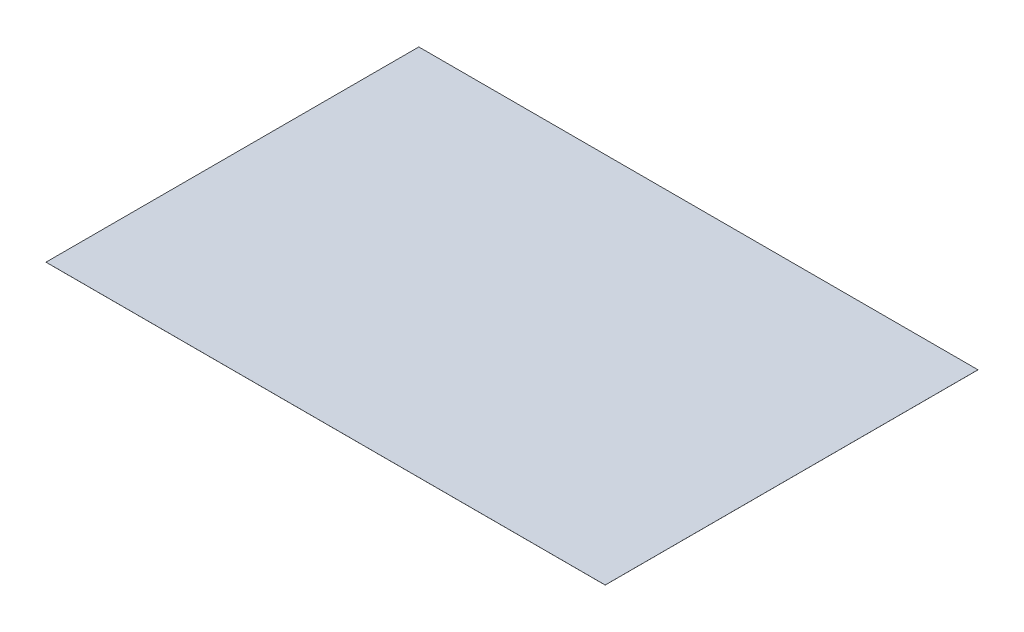
ISO-10303-21;
HEADER;
FILE_DESCRIPTION(('STEP AP214'),'2;1');
FILE_NAME('part.step','',(''),(''),'','','');
FILE_SCHEMA(('AUTOMOTIVE_DESIGN { 1 0 10303 214 1 1 1 1 }'));
ENDSEC;
DATA;
#1=APPLICATION_CONTEXT('core data for automotive mechanical design processes');
#2=APPLICATION_PROTOCOL_DEFINITION('international standard','automotive_design',2000,#1);
#3=PRODUCT_CONTEXT('',#1,'mechanical');
#4=PRODUCT('Part','Part','',(#3));
#5=PRODUCT_RELATED_PRODUCT_CATEGORY('part','',(#4));
#6=PRODUCT_DEFINITION_FORMATION('','',#4);
#7=PRODUCT_DEFINITION_CONTEXT('part definition',#1,'design');
#8=PRODUCT_DEFINITION('design','',#6,#7);
#9=PRODUCT_DEFINITION_SHAPE('','',#8);
#10=(LENGTH_UNIT() NAMED_UNIT(*) SI_UNIT(.MILLI.,.METRE.));
#11=(NAMED_UNIT(*) PLANE_ANGLE_UNIT() SI_UNIT($,.RADIAN.));
#12=(NAMED_UNIT(*) SI_UNIT($,.STERADIAN.) SOLID_ANGLE_UNIT());
#13=UNCERTAINTY_MEASURE_WITH_UNIT(LENGTH_MEASURE(1.E-05),#10,'distance_accuracy_value','');
#14=(GEOMETRIC_REPRESENTATION_CONTEXT(3) GLOBAL_UNCERTAINTY_ASSIGNED_CONTEXT((#13)) GLOBAL_UNIT_ASSIGNED_CONTEXT((#10,
#11,#12)) REPRESENTATION_CONTEXT('',''));
#15=CARTESIAN_POINT('',(0.,0.,0.));
#16=DIRECTION('',(0.,0.,1.));
#17=DIRECTION('',(1.,0.,0.));
#18=AXIS2_PLACEMENT_3D('',#15,#16,#17);
#19=CARTESIAN_POINT('',(300.,0.05,-200.));
#20=DIRECTION('',(-1.,0.,0.));
#21=DIRECTION('',(0.,0.,1.));
#22=AXIS2_PLACEMENT_3D('',#19,#20,#21);
#23=PLANE('',#22);
#24=DIRECTION('',(0.,0.,-1.));
#25=VECTOR('',#24,1.);
#26=CARTESIAN_POINT('',(300.,0.,-200.));
#27=LINE('',#26,#25);
#28=CARTESIAN_POINT('',(300.,0.,200.));
#29=VERTEX_POINT('',#28);
#30=CARTESIAN_POINT('',(300.,0.,-200.));
#31=VERTEX_POINT('',#30);
#32=EDGE_CURVE('E106',#29,#31,#27,.T.);
#33=ORIENTED_EDGE('',*,*,#32,.T.);
#34=DIRECTION('',(0.,-1.,0.));
#35=VECTOR('',#34,1.);
#36=CARTESIAN_POINT('',(300.,0.05,-200.));
#37=LINE('',#36,#35);
#38=CARTESIAN_POINT('',(300.,0.05,-200.));
#39=VERTEX_POINT('',#38);
#40=EDGE_CURVE('E11',#39,#31,#37,.T.);
#41=ORIENTED_EDGE('',*,*,#40,.F.);
#42=DIRECTION('',(0.,0.,-1.));
#43=VECTOR('',#42,1.);
#44=CARTESIAN_POINT('',(300.,0.05,-200.));
#45=LINE('',#44,#43);
#46=CARTESIAN_POINT('',(300.,0.05,200.));
#47=VERTEX_POINT('',#46);
#48=EDGE_CURVE('E94',#47,#39,#45,.T.);
#49=ORIENTED_EDGE('',*,*,#48,.F.);
#50=DIRECTION('',(0.,-1.,0.));
#51=VECTOR('',#50,1.);
#52=CARTESIAN_POINT('',(300.,0.05,200.));
#53=LINE('',#52,#51);
#54=EDGE_CURVE('E102',#47,#29,#53,.T.);
#55=ORIENTED_EDGE('',*,*,#54,.T.);
#56=EDGE_LOOP('',(#33,#41,#49,#55));
#57=FACE_BOUND('',#56,.T.);
#58=ADVANCED_FACE('F43',(#57),#23,.F.);
#59=CARTESIAN_POINT('',(-300.,0.05,-200.));
#60=DIRECTION('',(0.,0.,1.));
#61=DIRECTION('',(1.,0.,0.));
#62=AXIS2_PLACEMENT_3D('',#59,#60,#61);
#63=PLANE('',#62);
#64=DIRECTION('',(-1.,0.,0.));
#65=VECTOR('',#64,1.);
#66=CARTESIAN_POINT('',(-300.,0.,-200.));
#67=LINE('',#66,#65);
#68=CARTESIAN_POINT('',(-300.,0.,-200.));
#69=VERTEX_POINT('',#68);
#70=EDGE_CURVE('E98',#31,#69,#67,.T.);
#71=ORIENTED_EDGE('',*,*,#70,.T.);
#72=DIRECTION('',(0.,-1.,0.));
#73=VECTOR('',#72,1.);
#74=CARTESIAN_POINT('',(-300.,0.05,-200.));
#75=LINE('',#74,#73);
#76=CARTESIAN_POINT('',(-300.,0.05,-200.));
#77=VERTEX_POINT('',#76);
#78=EDGE_CURVE('E51',#77,#69,#75,.T.);
#79=ORIENTED_EDGE('',*,*,#78,.F.);
#80=DIRECTION('',(-1.,0.,0.));
#81=VECTOR('',#80,1.);
#82=CARTESIAN_POINT('',(-300.,0.05,-200.));
#83=LINE('',#82,#81);
#84=EDGE_CURVE('E89',#39,#77,#83,.T.);
#85=ORIENTED_EDGE('',*,*,#84,.F.);
#86=ORIENTED_EDGE('',*,*,#40,.T.);
#87=EDGE_LOOP('',(#71,#79,#85,#86));
#88=FACE_BOUND('',#87,.T.);
#89=ADVANCED_FACE('F97',(#88),#63,.F.);
#90=CARTESIAN_POINT('',(-300.,0.05,-200.));
#91=DIRECTION('',(1.,0.,0.));
#92=DIRECTION('',(0.,0.,-1.));
#93=AXIS2_PLACEMENT_3D('',#90,#91,#92);
#94=PLANE('',#93);
#95=DIRECTION('',(0.,0.,1.));
#96=VECTOR('',#95,1.);
#97=CARTESIAN_POINT('',(-300.,0.,-200.));
#98=LINE('',#97,#96);
#99=CARTESIAN_POINT('',(-300.,0.,200.));
#100=VERTEX_POINT('',#99);
#101=EDGE_CURVE('E76',#69,#100,#98,.T.);
#102=ORIENTED_EDGE('',*,*,#101,.T.);
#103=DIRECTION('',(0.,-1.,0.));
#104=VECTOR('',#103,1.);
#105=CARTESIAN_POINT('',(-300.,0.05,200.));
#106=LINE('',#105,#104);
#107=CARTESIAN_POINT('',(-300.,0.05,200.));
#108=VERTEX_POINT('',#107);
#109=EDGE_CURVE('E99',#108,#100,#106,.T.);
#110=ORIENTED_EDGE('',*,*,#109,.F.);
#111=DIRECTION('',(0.,0.,1.));
#112=VECTOR('',#111,1.);
#113=CARTESIAN_POINT('',(-300.,0.05,-200.));
#114=LINE('',#113,#112);
#115=EDGE_CURVE('E92',#77,#108,#114,.T.);
#116=ORIENTED_EDGE('',*,*,#115,.F.);
#117=ORIENTED_EDGE('',*,*,#78,.T.);
#118=EDGE_LOOP('',(#102,#110,#116,#117));
#119=FACE_BOUND('',#118,.T.);
#120=ADVANCED_FACE('F100',(#119),#94,.F.);
#121=CARTESIAN_POINT('',(-300.,0.05,200.));
#122=DIRECTION('',(0.,0.,-1.));
#123=DIRECTION('',(-1.,0.,0.));
#124=AXIS2_PLACEMENT_3D('',#121,#122,#123);
#125=PLANE('',#124);
#126=DIRECTION('',(1.,0.,0.));
#127=VECTOR('',#126,1.);
#128=CARTESIAN_POINT('',(-300.,0.,200.));
#129=LINE('',#128,#127);
#130=EDGE_CURVE('E82',#100,#29,#129,.T.);
#131=ORIENTED_EDGE('',*,*,#130,.T.);
#132=ORIENTED_EDGE('',*,*,#54,.F.);
#133=DIRECTION('',(1.,0.,0.));
#134=VECTOR('',#133,1.);
#135=CARTESIAN_POINT('',(-300.,0.05,200.));
#136=LINE('',#135,#134);
#137=EDGE_CURVE('E59',#108,#47,#136,.T.);
#138=ORIENTED_EDGE('',*,*,#137,.F.);
#139=ORIENTED_EDGE('',*,*,#109,.T.);
#140=EDGE_LOOP('',(#131,#132,#138,#139));
#141=FACE_BOUND('',#140,.T.);
#142=ADVANCED_FACE('F113',(#141),#125,.F.);
#143=CARTESIAN_POINT('',(0.,0.05,0.));
#144=DIRECTION('',(0.,1.,0.));
#145=DIRECTION('',(0.,0.,1.));
#146=AXIS2_PLACEMENT_3D('',#143,#144,#145);
#147=PLANE('',#146);
#148=ORIENTED_EDGE('',*,*,#48,.T.);
#149=ORIENTED_EDGE('',*,*,#84,.T.);
#150=ORIENTED_EDGE('',*,*,#115,.T.);
#151=ORIENTED_EDGE('',*,*,#137,.T.);
#152=EDGE_LOOP('',(#148,#149,#150,#151));
#153=FACE_BOUND('',#152,.T.);
#154=ADVANCED_FACE('F90',(#153),#147,.T.);
#155=CARTESIAN_POINT('',(0.,0.,0.));
#156=DIRECTION('',(0.,1.,0.));
#157=DIRECTION('',(0.,0.,1.));
#158=AXIS2_PLACEMENT_3D('',#155,#156,#157);
#159=PLANE('',#158);
#160=ORIENTED_EDGE('',*,*,#32,.F.);
#161=ORIENTED_EDGE('',*,*,#130,.F.);
#162=ORIENTED_EDGE('',*,*,#101,.F.);
#163=ORIENTED_EDGE('',*,*,#70,.F.);
#164=EDGE_LOOP('',(#160,#161,#162,#163));
#165=FACE_BOUND('',#164,.T.);
#166=ADVANCED_FACE('F116',(#165),#159,.F.);
#167=CLOSED_SHELL('',(#58,#89,#120,#142,#154,#166));
#168=MANIFOLD_SOLID_BREP('B2',#167);
#169=ADVANCED_BREP_SHAPE_REPRESENTATION('',(#18,#168),#14);
#170=SHAPE_DEFINITION_REPRESENTATION(#9,#169);
ENDSEC;
END-ISO-10303-21;
